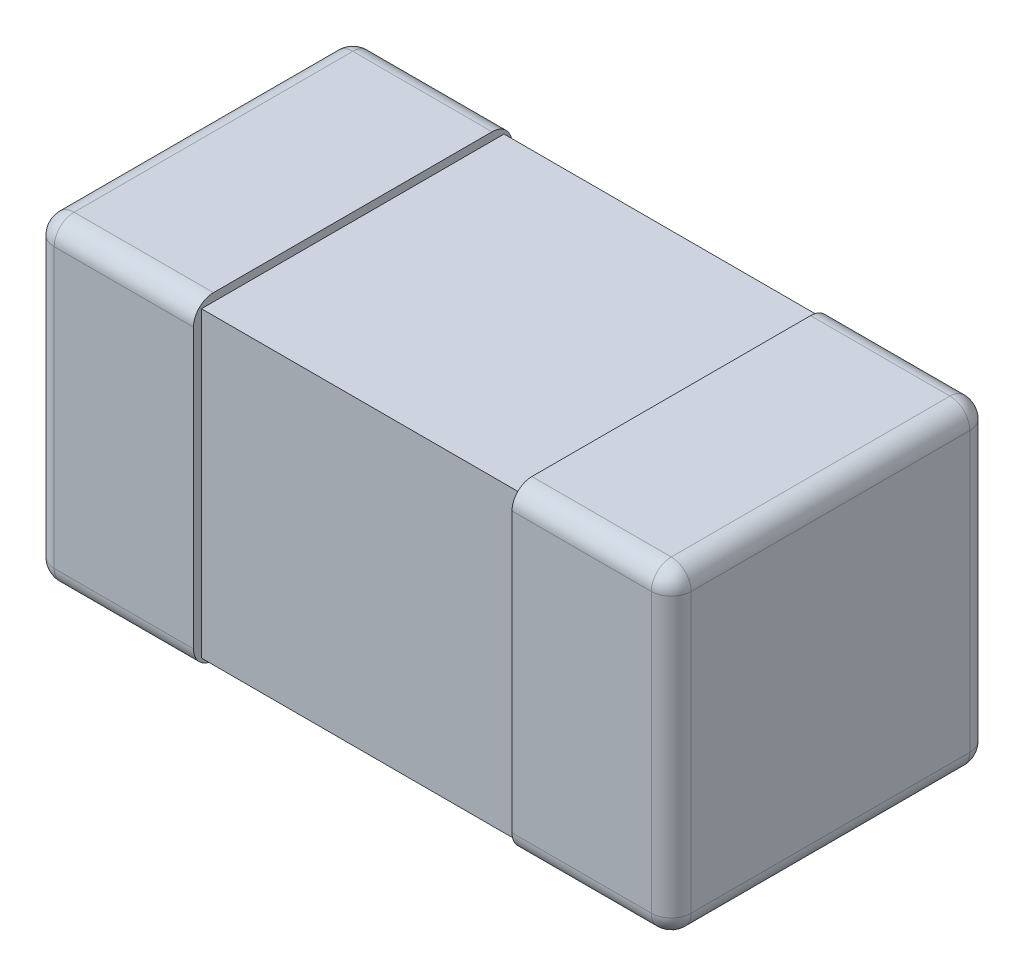
ISO-10303-21;
HEADER;
FILE_DESCRIPTION(('STEP AP214'),'2;1');
FILE_NAME('part.step','',(''),(''),'','','');
FILE_SCHEMA(('AUTOMOTIVE_DESIGN { 1 0 10303 214 1 1 1 1 }'));
ENDSEC;
DATA;
#1=APPLICATION_CONTEXT('core data for automotive mechanical design processes');
#2=APPLICATION_PROTOCOL_DEFINITION('international standard','automotive_design',2000,#1);
#3=PRODUCT_CONTEXT('',#1,'mechanical');
#4=PRODUCT('Part','Part','',(#3));
#5=PRODUCT_RELATED_PRODUCT_CATEGORY('part','',(#4));
#6=PRODUCT_DEFINITION_FORMATION('','',#4);
#7=PRODUCT_DEFINITION_CONTEXT('part definition',#1,'design');
#8=PRODUCT_DEFINITION('design','',#6,#7);
#9=PRODUCT_DEFINITION_SHAPE('','',#8);
#10=(LENGTH_UNIT() NAMED_UNIT(*) SI_UNIT(.MILLI.,.METRE.));
#11=(NAMED_UNIT(*) PLANE_ANGLE_UNIT() SI_UNIT($,.RADIAN.));
#12=(NAMED_UNIT(*) SI_UNIT($,.STERADIAN.) SOLID_ANGLE_UNIT());
#13=UNCERTAINTY_MEASURE_WITH_UNIT(LENGTH_MEASURE(1.E-05),#10,'distance_accuracy_value','');
#14=(GEOMETRIC_REPRESENTATION_CONTEXT(3) GLOBAL_UNCERTAINTY_ASSIGNED_CONTEXT((#13)) GLOBAL_UNIT_ASSIGNED_CONTEXT((#10,
#11,#12)) REPRESENTATION_CONTEXT('',''));
#15=CARTESIAN_POINT('',(0.,0.,0.));
#16=DIRECTION('',(0.,0.,1.));
#17=DIRECTION('',(1.,0.,0.));
#18=AXIS2_PLACEMENT_3D('',#15,#16,#17);
#19=CARTESIAN_POINT('',(-0.799999999999995,0.8,0.400000000000011));
#20=DIRECTION('',(0.,0.,-1.));
#21=DIRECTION('',(-1.,0.,0.));
#22=AXIS2_PLACEMENT_3D('',#19,#20,#21);
#23=PLANE('',#22);
#24=DIRECTION('',(0.,-1.,0.));
#25=VECTOR('',#24,1.);
#26=CARTESIAN_POINT('',(-0.399999999999995,0.8,0.400000000000011));
#27=LINE('',#26,#25);
#28=CARTESIAN_POINT('',(-0.399999999999995,0.75,0.400000000000011));
#29=VERTEX_POINT('',#28);
#30=CARTESIAN_POINT('',(-0.399999999999995,0.05,0.400000000000011));
#31=VERTEX_POINT('',#30);
#32=EDGE_CURVE('E253',#29,#31,#27,.T.);
#33=ORIENTED_EDGE('',*,*,#32,.F.);
#34=DIRECTION('',(1.,0.,0.));
#35=VECTOR('',#34,1.);
#36=CARTESIAN_POINT('',(-0.799999999999995,0.75,0.400000000000011));
#37=LINE('',#36,#35);
#38=CARTESIAN_POINT('',(-0.749999999999995,0.75,0.400000000000011));
#39=VERTEX_POINT('',#38);
#40=EDGE_CURVE('E284',#29,#39,#37,.F.);
#41=ORIENTED_EDGE('',*,*,#40,.T.);
#42=DIRECTION('',(0.,-1.,0.));
#43=VECTOR('',#42,1.);
#44=CARTESIAN_POINT('',(-0.749999999999995,0.8,0.400000000000011));
#45=LINE('',#44,#43);
#46=CARTESIAN_POINT('',(-0.749999999999995,0.05,0.400000000000011));
#47=VERTEX_POINT('',#46);
#48=EDGE_CURVE('E280',#39,#47,#45,.T.);
#49=ORIENTED_EDGE('',*,*,#48,.T.);
#50=DIRECTION('',(1.,0.,0.));
#51=VECTOR('',#50,1.);
#52=CARTESIAN_POINT('',(-0.799999999999995,0.05,0.400000000000011));
#53=LINE('',#52,#51);
#54=EDGE_CURVE('E282',#47,#31,#53,.T.);
#55=ORIENTED_EDGE('',*,*,#54,.T.);
#56=EDGE_LOOP('',(#33,#41,#49,#55));
#57=FACE_BOUND('',#56,.T.);
#58=ADVANCED_FACE('F38',(#57),#23,.F.);
#59=CARTESIAN_POINT('',(-0.799999999999995,0.8,-0.399999999999998));
#60=DIRECTION('',(0.,0.,1.));
#61=DIRECTION('',(1.,0.,0.));
#62=AXIS2_PLACEMENT_3D('',#59,#60,#61);
#63=PLANE('',#62);
#64=DIRECTION('',(0.,1.,0.));
#65=VECTOR('',#64,1.);
#66=CARTESIAN_POINT('',(-0.399999999999995,0.8,-0.399999999999998));
#67=LINE('',#66,#65);
#68=CARTESIAN_POINT('',(-0.399999999999995,0.05,-0.399999999999998));
#69=VERTEX_POINT('',#68);
#70=CARTESIAN_POINT('',(-0.399999999999995,0.75,-0.399999999999998));
#71=VERTEX_POINT('',#70);
#72=EDGE_CURVE('E250',#69,#71,#67,.T.);
#73=ORIENTED_EDGE('',*,*,#72,.F.);
#74=DIRECTION('',(-1.,0.,0.));
#75=VECTOR('',#74,1.);
#76=CARTESIAN_POINT('',(-0.799999999999995,0.05,-0.399999999999998));
#77=LINE('',#76,#75);
#78=CARTESIAN_POINT('',(-0.749999999999995,0.05,-0.399999999999998));
#79=VERTEX_POINT('',#78);
#80=EDGE_CURVE('E296',#69,#79,#77,.T.);
#81=ORIENTED_EDGE('',*,*,#80,.T.);
#82=DIRECTION('',(0.,-1.,0.));
#83=VECTOR('',#82,1.);
#84=CARTESIAN_POINT('',(-0.749999999999995,0.8,-0.399999999999998));
#85=LINE('',#84,#83);
#86=CARTESIAN_POINT('',(-0.749999999999995,0.75,-0.399999999999998));
#87=VERTEX_POINT('',#86);
#88=EDGE_CURVE('E292',#79,#87,#85,.F.);
#89=ORIENTED_EDGE('',*,*,#88,.T.);
#90=DIRECTION('',(-1.,0.,0.));
#91=VECTOR('',#90,1.);
#92=CARTESIAN_POINT('',(-0.399999999999995,0.75,-0.399999999999998));
#93=LINE('',#92,#91);
#94=EDGE_CURVE('E294',#87,#71,#93,.F.);
#95=ORIENTED_EDGE('',*,*,#94,.T.);
#96=EDGE_LOOP('',(#73,#81,#89,#95));
#97=FACE_BOUND('',#96,.T.);
#98=ADVANCED_FACE('F489',(#97),#63,.F.);
#99=CARTESIAN_POINT('',(0.,0.8,0.));
#100=DIRECTION('',(0.,1.,0.));
#101=DIRECTION('',(0.,0.,1.));
#102=AXIS2_PLACEMENT_3D('',#99,#100,#101);
#103=PLANE('',#102);
#104=DIRECTION('',(0.,0.,1.));
#105=VECTOR('',#104,1.);
#106=CARTESIAN_POINT('',(-0.749999999999995,0.8,0.400000000000011));
#107=LINE('',#106,#105);
#108=CARTESIAN_POINT('',(-0.749999999999995,0.8,-0.349999999999998));
#109=VERTEX_POINT('',#108);
#110=CARTESIAN_POINT('',(-0.749999999999995,0.8,0.350000000000011));
#111=VERTEX_POINT('',#110);
#112=EDGE_CURVE('E265',#109,#111,#107,.T.);
#113=ORIENTED_EDGE('',*,*,#112,.T.);
#114=DIRECTION('',(1.,0.,0.));
#115=VECTOR('',#114,1.);
#116=CARTESIAN_POINT('',(-0.399999999999995,0.8,0.350000000000011));
#117=LINE('',#116,#115);
#118=CARTESIAN_POINT('',(-0.399999999999995,0.8,0.350000000000011));
#119=VERTEX_POINT('',#118);
#120=EDGE_CURVE('E269',#111,#119,#117,.T.);
#121=ORIENTED_EDGE('',*,*,#120,.T.);
#122=DIRECTION('',(0.,0.,-1.));
#123=VECTOR('',#122,1.);
#124=CARTESIAN_POINT('',(-0.399999999999995,0.8,0.));
#125=LINE('',#124,#123);
#126=CARTESIAN_POINT('',(-0.399999999999995,0.8,-0.349999999999998));
#127=VERTEX_POINT('',#126);
#128=EDGE_CURVE('E256',#119,#127,#125,.T.);
#129=ORIENTED_EDGE('',*,*,#128,.T.);
#130=DIRECTION('',(-1.,0.,0.));
#131=VECTOR('',#130,1.);
#132=CARTESIAN_POINT('',(-0.799999999999995,0.8,-0.349999999999998));
#133=LINE('',#132,#131);
#134=EDGE_CURVE('E267',#127,#109,#133,.T.);
#135=ORIENTED_EDGE('',*,*,#134,.T.);
#136=EDGE_LOOP('',(#113,#121,#129,#135));
#137=FACE_BOUND('',#136,.T.);
#138=ADVANCED_FACE('F495',(#137),#103,.T.);
#139=CARTESIAN_POINT('',(0.,0.,0.));
#140=DIRECTION('',(0.,1.,0.));
#141=DIRECTION('',(0.,0.,1.));
#142=AXIS2_PLACEMENT_3D('',#139,#140,#141);
#143=PLANE('',#142);
#144=DIRECTION('',(0.,0.,-1.));
#145=VECTOR('',#144,1.);
#146=CARTESIAN_POINT('',(-0.399999999999995,0.,0.));
#147=LINE('',#146,#145);
#148=CARTESIAN_POINT('',(-0.399999999999995,0.,0.350000000000011));
#149=VERTEX_POINT('',#148);
#150=CARTESIAN_POINT('',(-0.399999999999995,0.,-0.349999999999998));
#151=VERTEX_POINT('',#150);
#152=EDGE_CURVE('E262',#149,#151,#147,.T.);
#153=ORIENTED_EDGE('',*,*,#152,.F.);
#154=DIRECTION('',(1.,0.,0.));
#155=VECTOR('',#154,1.);
#156=CARTESIAN_POINT('',(0.,0.,0.350000000000011));
#157=LINE('',#156,#155);
#158=CARTESIAN_POINT('',(-0.749999999999995,0.,0.350000000000011));
#159=VERTEX_POINT('',#158);
#160=EDGE_CURVE('E290',#149,#159,#157,.F.);
#161=ORIENTED_EDGE('',*,*,#160,.T.);
#162=DIRECTION('',(0.,0.,1.));
#163=VECTOR('',#162,1.);
#164=CARTESIAN_POINT('',(-0.749999999999995,0.,0.));
#165=LINE('',#164,#163);
#166=CARTESIAN_POINT('',(-0.749999999999995,0.,-0.349999999999998));
#167=VERTEX_POINT('',#166);
#168=EDGE_CURVE('E286',#159,#167,#165,.F.);
#169=ORIENTED_EDGE('',*,*,#168,.T.);
#170=DIRECTION('',(-1.,0.,0.));
#171=VECTOR('',#170,1.);
#172=CARTESIAN_POINT('',(0.,0.,-0.349999999999998));
#173=LINE('',#172,#171);
#174=EDGE_CURVE('E288',#167,#151,#173,.F.);
#175=ORIENTED_EDGE('',*,*,#174,.T.);
#176=EDGE_LOOP('',(#153,#161,#169,#175));
#177=FACE_BOUND('',#176,.T.);
#178=ADVANCED_FACE('F515',(#177),#143,.F.);
#179=CARTESIAN_POINT('',(-0.799999999999995,0.8,-0.399999999999998));
#180=DIRECTION('',(1.,0.,0.));
#181=DIRECTION('',(0.,0.,-1.));
#182=AXIS2_PLACEMENT_3D('',#179,#180,#181);
#183=PLANE('',#182);
#184=DIRECTION('',(0.,0.,1.));
#185=VECTOR('',#184,1.);
#186=CARTESIAN_POINT('',(-0.799999999999995,0.75,-0.399999999999998));
#187=LINE('',#186,#185);
#188=CARTESIAN_POINT('',(-0.799999999999995,0.75,0.350000000000011));
#189=VERTEX_POINT('',#188);
#190=CARTESIAN_POINT('',(-0.799999999999995,0.75,-0.349999999999998));
#191=VERTEX_POINT('',#190);
#192=EDGE_CURVE('E340',#189,#191,#187,.F.);
#193=ORIENTED_EDGE('',*,*,#192,.T.);
#194=DIRECTION('',(0.,-1.,0.));
#195=VECTOR('',#194,1.);
#196=CARTESIAN_POINT('',(-0.799999999999995,0.8,-0.349999999999998));
#197=LINE('',#196,#195);
#198=CARTESIAN_POINT('',(-0.799999999999995,0.05,-0.349999999999998));
#199=VERTEX_POINT('',#198);
#200=EDGE_CURVE('E13',#191,#199,#197,.T.);
#201=ORIENTED_EDGE('',*,*,#200,.T.);
#202=DIRECTION('',(0.,0.,1.));
#203=VECTOR('',#202,1.);
#204=CARTESIAN_POINT('',(-0.799999999999995,0.05,-0.399999999999998));
#205=LINE('',#204,#203);
#206=CARTESIAN_POINT('',(-0.799999999999995,0.05,0.350000000000011));
#207=VERTEX_POINT('',#206);
#208=EDGE_CURVE('E47',#199,#207,#205,.T.);
#209=ORIENTED_EDGE('',*,*,#208,.T.);
#210=DIRECTION('',(0.,-1.,0.));
#211=VECTOR('',#210,1.);
#212=CARTESIAN_POINT('',(-0.799999999999995,0.8,0.350000000000011));
#213=LINE('',#212,#211);
#214=EDGE_CURVE('E342',#207,#189,#213,.F.);
#215=ORIENTED_EDGE('',*,*,#214,.T.);
#216=EDGE_LOOP('',(#193,#201,#209,#215));
#217=FACE_BOUND('',#216,.T.);
#218=ADVANCED_FACE('F537',(#217),#183,.F.);
#219=CARTESIAN_POINT('',(-2.07279220613579,0.779999999999999,-0.379999999999998));
#220=DIRECTION('',(0.,1.,0.));
#221=DIRECTION('',(0.,0.,1.));
#222=AXIS2_PLACEMENT_3D('',#219,#220,#221);
#223=PLANE('',#222);
#224=DIRECTION('',(1.,0.,0.));
#225=VECTOR('',#224,1.);
#226=CARTESIAN_POINT('',(-2.07279220613579,0.780000000000001,0.380000000000011));
#227=LINE('',#226,#225);
#228=CARTESIAN_POINT('',(-0.399999999999995,0.780000000000001,0.380000000000011));
#229=VERTEX_POINT('',#228);
#230=CARTESIAN_POINT('',(0.399999999999995,0.780000000000001,0.380000000000011));
#231=VERTEX_POINT('',#230);
#232=EDGE_CURVE('E210',#229,#231,#227,.T.);
#233=ORIENTED_EDGE('',*,*,#232,.T.);
#234=DIRECTION('',(0.,0.,-1.));
#235=VECTOR('',#234,1.);
#236=CARTESIAN_POINT('',(0.399999999999995,0.779999999999999,-0.379999999999998));
#237=LINE('',#236,#235);
#238=CARTESIAN_POINT('',(0.399999999999995,0.779999999999999,-0.379999999999998));
#239=VERTEX_POINT('',#238);
#240=EDGE_CURVE('E223',#231,#239,#237,.T.);
#241=ORIENTED_EDGE('',*,*,#240,.T.);
#242=DIRECTION('',(1.,0.,0.));
#243=VECTOR('',#242,1.);
#244=CARTESIAN_POINT('',(-2.07279220613579,0.779999999999999,-0.379999999999998));
#245=LINE('',#244,#243);
#246=CARTESIAN_POINT('',(-0.399999999999995,0.779999999999999,-0.379999999999998));
#247=VERTEX_POINT('',#246);
#248=EDGE_CURVE('E225',#247,#239,#245,.T.);
#249=ORIENTED_EDGE('',*,*,#248,.F.);
#250=DIRECTION('',(0.,0.,-1.));
#251=VECTOR('',#250,1.);
#252=CARTESIAN_POINT('',(-0.399999999999995,0.779999999999999,-0.379999999999998));
#253=LINE('',#252,#251);
#254=EDGE_CURVE('E236',#229,#247,#253,.T.);
#255=ORIENTED_EDGE('',*,*,#254,.F.);
#256=EDGE_LOOP('',(#233,#241,#249,#255));
#257=FACE_BOUND('',#256,.T.);
#258=ADVANCED_FACE('F534',(#257),#223,.T.);
#259=CARTESIAN_POINT('',(-2.07279220613579,0.0199999999999992,0.380000000000011));
#260=DIRECTION('',(0.,0.,1.));
#261=DIRECTION('',(0.,-1.,0.));
#262=AXIS2_PLACEMENT_3D('',#259,#260,#261);
#263=PLANE('',#262);
#264=DIRECTION('',(1.,0.,0.));
#265=VECTOR('',#264,1.);
#266=CARTESIAN_POINT('',(-2.07279220613579,0.0199999999999992,0.380000000000011));
#267=LINE('',#266,#265);
#268=CARTESIAN_POINT('',(-0.399999999999995,0.0199999999999992,0.380000000000011));
#269=VERTEX_POINT('',#268);
#270=CARTESIAN_POINT('',(0.399999999999995,0.0199999999999992,0.380000000000011));
#271=VERTEX_POINT('',#270);
#272=EDGE_CURVE('E198',#269,#271,#267,.T.);
#273=ORIENTED_EDGE('',*,*,#272,.T.);
#274=DIRECTION('',(0.,1.,0.));
#275=VECTOR('',#274,1.);
#276=CARTESIAN_POINT('',(0.399999999999995,0.0199999999999992,0.380000000000011));
#277=LINE('',#276,#275);
#278=EDGE_CURVE('E203',#271,#231,#277,.T.);
#279=ORIENTED_EDGE('',*,*,#278,.T.);
#280=ORIENTED_EDGE('',*,*,#232,.F.);
#281=DIRECTION('',(0.,1.,0.));
#282=VECTOR('',#281,1.);
#283=CARTESIAN_POINT('',(-0.399999999999995,0.0199999999999992,0.380000000000011));
#284=LINE('',#283,#282);
#285=EDGE_CURVE('E206',#269,#229,#284,.T.);
#286=ORIENTED_EDGE('',*,*,#285,.F.);
#287=EDGE_LOOP('',(#273,#279,#280,#286));
#288=FACE_BOUND('',#287,.T.);
#289=ADVANCED_FACE('F200',(#288),#263,.T.);
#290=CARTESIAN_POINT('',(-2.07279220613579,0.0199999999999992,-0.379999999999998));
#291=DIRECTION('',(0.,-1.,0.));
#292=DIRECTION('',(0.,0.,-1.));
#293=AXIS2_PLACEMENT_3D('',#290,#291,#292);
#294=PLANE('',#293);
#295=DIRECTION('',(1.,0.,0.));
#296=VECTOR('',#295,1.);
#297=CARTESIAN_POINT('',(-2.07279220613579,0.0199999999999992,-0.379999999999998));
#298=LINE('',#297,#296);
#299=CARTESIAN_POINT('',(-0.399999999999995,0.0199999999999992,-0.379999999999998));
#300=VERTEX_POINT('',#299);
#301=CARTESIAN_POINT('',(0.399999999999995,0.0199999999999992,-0.379999999999998));
#302=VERTEX_POINT('',#301);
#303=EDGE_CURVE('E209',#300,#302,#298,.T.);
#304=ORIENTED_EDGE('',*,*,#303,.T.);
#305=DIRECTION('',(0.,0.,1.));
#306=VECTOR('',#305,1.);
#307=CARTESIAN_POINT('',(0.399999999999995,0.0199999999999992,-0.379999999999998));
#308=LINE('',#307,#306);
#309=EDGE_CURVE('E213',#302,#271,#308,.T.);
#310=ORIENTED_EDGE('',*,*,#309,.T.);
#311=ORIENTED_EDGE('',*,*,#272,.F.);
#312=DIRECTION('',(0.,0.,1.));
#313=VECTOR('',#312,1.);
#314=CARTESIAN_POINT('',(-0.399999999999995,0.0199999999999992,-0.379999999999998));
#315=LINE('',#314,#313);
#316=EDGE_CURVE('E231',#300,#269,#315,.T.);
#317=ORIENTED_EDGE('',*,*,#316,.F.);
#318=EDGE_LOOP('',(#304,#310,#311,#317));
#319=FACE_BOUND('',#318,.T.);
#320=ADVANCED_FACE('F214',(#319),#294,.T.);
#321=CARTESIAN_POINT('',(-2.07279220613579,0.779999999999999,-0.379999999999998));
#322=DIRECTION('',(0.,0.,-1.));
#323=DIRECTION('',(0.,1.,0.));
#324=AXIS2_PLACEMENT_3D('',#321,#322,#323);
#325=PLANE('',#324);
#326=ORIENTED_EDGE('',*,*,#248,.T.);
#327=DIRECTION('',(0.,-1.,0.));
#328=VECTOR('',#327,1.);
#329=CARTESIAN_POINT('',(0.399999999999995,0.779999999999999,-0.379999999999998));
#330=LINE('',#329,#328);
#331=EDGE_CURVE('E219',#239,#302,#330,.T.);
#332=ORIENTED_EDGE('',*,*,#331,.T.);
#333=ORIENTED_EDGE('',*,*,#303,.F.);
#334=DIRECTION('',(0.,-1.,0.));
#335=VECTOR('',#334,1.);
#336=CARTESIAN_POINT('',(-0.399999999999995,0.779999999999999,-0.379999999999998));
#337=LINE('',#336,#335);
#338=EDGE_CURVE('E233',#247,#300,#337,.T.);
#339=ORIENTED_EDGE('',*,*,#338,.F.);
#340=EDGE_LOOP('',(#326,#332,#333,#339));
#341=FACE_BOUND('',#340,.T.);
#342=ADVANCED_FACE('F526',(#341),#325,.T.);
#343=CARTESIAN_POINT('',(-0.399999999999995,0.8,-0.399999999999998));
#344=DIRECTION('',(1.,0.,0.));
#345=DIRECTION('',(0.,0.,-1.));
#346=AXIS2_PLACEMENT_3D('',#343,#344,#345);
#347=PLANE('',#346);
#348=ORIENTED_EDGE('',*,*,#128,.F.);
#349=CARTESIAN_POINT('',(-0.399999999999995,0.75,0.350000000000011));
#350=DIRECTION('',(1.,0.,0.));
#351=DIRECTION('',(0.,0.,-1.));
#352=AXIS2_PLACEMENT_3D('',#349,#350,#351);
#353=CIRCLE('',#352,0.05);
#354=EDGE_CURVE('E278',#119,#29,#353,.T.);
#355=ORIENTED_EDGE('',*,*,#354,.T.);
#356=ORIENTED_EDGE('',*,*,#32,.T.);
#357=CARTESIAN_POINT('',(-0.399999999999995,0.05,0.350000000000011));
#358=DIRECTION('',(1.,0.,0.));
#359=DIRECTION('',(0.,0.,-1.));
#360=AXIS2_PLACEMENT_3D('',#357,#358,#359);
#361=CIRCLE('',#360,0.05);
#362=EDGE_CURVE('E276',#31,#149,#361,.T.);
#363=ORIENTED_EDGE('',*,*,#362,.T.);
#364=ORIENTED_EDGE('',*,*,#152,.T.);
#365=CARTESIAN_POINT('',(-0.399999999999995,0.05,-0.349999999999998));
#366=DIRECTION('',(1.,0.,0.));
#367=DIRECTION('',(0.,0.,-1.));
#368=AXIS2_PLACEMENT_3D('',#365,#366,#367);
#369=CIRCLE('',#368,0.05);
#370=EDGE_CURVE('E274',#151,#69,#369,.T.);
#371=ORIENTED_EDGE('',*,*,#370,.T.);
#372=ORIENTED_EDGE('',*,*,#72,.T.);
#373=CARTESIAN_POINT('',(-0.399999999999995,0.75,-0.349999999999998));
#374=DIRECTION('',(1.,0.,0.));
#375=DIRECTION('',(0.,0.,-1.));
#376=AXIS2_PLACEMENT_3D('',#373,#374,#375);
#377=CIRCLE('',#376,0.05);
#378=EDGE_CURVE('E272',#71,#127,#377,.T.);
#379=ORIENTED_EDGE('',*,*,#378,.T.);
#380=EDGE_LOOP('',(#348,#355,#356,#363,#364,#371,#372,#379));
#381=FACE_BOUND('',#380,.T.);
#382=ORIENTED_EDGE('',*,*,#254,.T.);
#383=ORIENTED_EDGE('',*,*,#338,.T.);
#384=ORIENTED_EDGE('',*,*,#316,.T.);
#385=ORIENTED_EDGE('',*,*,#285,.T.);
#386=EDGE_LOOP('',(#382,#383,#384,#385));
#387=FACE_BOUND('',#386,.T.);
#388=ADVANCED_FACE('F521',(#381,#387),#347,.T.);
#389=CARTESIAN_POINT('',(0.399999999999995,0.8,-0.399999999999998));
#390=DIRECTION('',(-1.,0.,0.));
#391=DIRECTION('',(0.,0.,1.));
#392=AXIS2_PLACEMENT_3D('',#389,#390,#391);
#393=PLANE('',#392);
#394=DIRECTION('',(0.,-1.,0.));
#395=VECTOR('',#394,1.);
#396=CARTESIAN_POINT('',(0.399999999999995,0.8,-0.399999999999998));
#397=LINE('',#396,#395);
#398=CARTESIAN_POINT('',(0.399999999999995,0.75,-0.399999999999998));
#399=VERTEX_POINT('',#398);
#400=CARTESIAN_POINT('',(0.399999999999995,0.05,-0.399999999999998));
#401=VERTEX_POINT('',#400);
#402=EDGE_CURVE('E230',#399,#401,#397,.T.);
#403=ORIENTED_EDGE('',*,*,#402,.T.);
#404=CARTESIAN_POINT('',(0.399999999999995,0.05,-0.349999999999998));
#405=DIRECTION('',(-1.,0.,0.));
#406=DIRECTION('',(0.,0.,1.));
#407=AXIS2_PLACEMENT_3D('',#404,#405,#406);
#408=CIRCLE('',#407,0.05);
#409=CARTESIAN_POINT('',(0.399999999999995,0.,-0.349999999999998));
#410=VERTEX_POINT('',#409);
#411=EDGE_CURVE('E311',#401,#410,#408,.T.);
#412=ORIENTED_EDGE('',*,*,#411,.T.);
#413=DIRECTION('',(0.,0.,1.));
#414=VECTOR('',#413,1.);
#415=CARTESIAN_POINT('',(0.399999999999995,0.,0.));
#416=LINE('',#415,#414);
#417=CARTESIAN_POINT('',(0.399999999999995,0.,0.350000000000011));
#418=VERTEX_POINT('',#417);
#419=EDGE_CURVE('E259',#410,#418,#416,.T.);
#420=ORIENTED_EDGE('',*,*,#419,.T.);
#421=CARTESIAN_POINT('',(0.399999999999995,0.05,0.350000000000011));
#422=DIRECTION('',(-1.,0.,0.));
#423=DIRECTION('',(0.,0.,1.));
#424=AXIS2_PLACEMENT_3D('',#421,#422,#423);
#425=CIRCLE('',#424,0.05);
#426=CARTESIAN_POINT('',(0.399999999999995,0.05,0.400000000000011));
#427=VERTEX_POINT('',#426);
#428=EDGE_CURVE('E309',#418,#427,#425,.T.);
#429=ORIENTED_EDGE('',*,*,#428,.T.);
#430=DIRECTION('',(0.,1.,0.));
#431=VECTOR('',#430,1.);
#432=CARTESIAN_POINT('',(0.399999999999995,0.8,0.400000000000011));
#433=LINE('',#432,#431);
#434=CARTESIAN_POINT('',(0.399999999999995,0.75,0.400000000000011));
#435=VERTEX_POINT('',#434);
#436=EDGE_CURVE('E244',#427,#435,#433,.T.);
#437=ORIENTED_EDGE('',*,*,#436,.T.);
#438=CARTESIAN_POINT('',(0.399999999999995,0.75,0.350000000000011));
#439=DIRECTION('',(-1.,0.,0.));
#440=DIRECTION('',(0.,0.,1.));
#441=AXIS2_PLACEMENT_3D('',#438,#439,#440);
#442=CIRCLE('',#441,0.05);
#443=CARTESIAN_POINT('',(0.399999999999995,0.8,0.350000000000011));
#444=VERTEX_POINT('',#443);
#445=EDGE_CURVE('E307',#435,#444,#442,.T.);
#446=ORIENTED_EDGE('',*,*,#445,.T.);
#447=DIRECTION('',(0.,0.,1.));
#448=VECTOR('',#447,1.);
#449=CARTESIAN_POINT('',(0.399999999999995,0.8,0.));
#450=LINE('',#449,#448);
#451=CARTESIAN_POINT('',(0.399999999999995,0.8,-0.349999999999998));
#452=VERTEX_POINT('',#451);
#453=EDGE_CURVE('E247',#452,#444,#450,.T.);
#454=ORIENTED_EDGE('',*,*,#453,.F.);
#455=CARTESIAN_POINT('',(0.399999999999995,0.75,-0.349999999999998));
#456=DIRECTION('',(-1.,0.,0.));
#457=DIRECTION('',(0.,0.,1.));
#458=AXIS2_PLACEMENT_3D('',#455,#456,#457);
#459=CIRCLE('',#458,0.05);
#460=EDGE_CURVE('E305',#452,#399,#459,.T.);
#461=ORIENTED_EDGE('',*,*,#460,.T.);
#462=EDGE_LOOP('',(#403,#412,#420,#429,#437,#446,#454,#461));
#463=FACE_BOUND('',#462,.T.);
#464=ORIENTED_EDGE('',*,*,#331,.F.);
#465=ORIENTED_EDGE('',*,*,#240,.F.);
#466=ORIENTED_EDGE('',*,*,#278,.F.);
#467=ORIENTED_EDGE('',*,*,#309,.F.);
#468=EDGE_LOOP('',(#464,#465,#466,#467));
#469=FACE_BOUND('',#468,.T.);
#470=ADVANCED_FACE('F221',(#463,#469),#393,.T.);
#471=CARTESIAN_POINT('',(0.799999999999995,0.8,-0.399999999999998));
#472=DIRECTION('',(-1.,0.,0.));
#473=DIRECTION('',(0.,0.,1.));
#474=AXIS2_PLACEMENT_3D('',#471,#472,#473);
#475=PLANE('',#474);
#476=DIRECTION('',(0.,0.,-1.));
#477=VECTOR('',#476,1.);
#478=CARTESIAN_POINT('',(0.799999999999995,0.05,-0.399999999999998));
#479=LINE('',#478,#477);
#480=CARTESIAN_POINT('',(0.799999999999995,0.05,0.350000000000011));
#481=VERTEX_POINT('',#480);
#482=CARTESIAN_POINT('',(0.799999999999995,0.05,-0.349999999999998));
#483=VERTEX_POINT('',#482);
#484=EDGE_CURVE('E335',#481,#483,#479,.T.);
#485=ORIENTED_EDGE('',*,*,#484,.T.);
#486=DIRECTION('',(0.,-1.,0.));
#487=VECTOR('',#486,1.);
#488=CARTESIAN_POINT('',(0.799999999999995,0.8,-0.349999999999998));
#489=LINE('',#488,#487);
#490=CARTESIAN_POINT('',(0.799999999999995,0.75,-0.349999999999998));
#491=VERTEX_POINT('',#490);
#492=EDGE_CURVE('E337',#483,#491,#489,.F.);
#493=ORIENTED_EDGE('',*,*,#492,.T.);
#494=DIRECTION('',(0.,0.,-1.));
#495=VECTOR('',#494,1.);
#496=CARTESIAN_POINT('',(0.799999999999995,0.75,0.400000000000011));
#497=LINE('',#496,#495);
#498=CARTESIAN_POINT('',(0.799999999999995,0.75,0.350000000000011));
#499=VERTEX_POINT('',#498);
#500=EDGE_CURVE('E331',#491,#499,#497,.F.);
#501=ORIENTED_EDGE('',*,*,#500,.T.);
#502=DIRECTION('',(0.,-1.,0.));
#503=VECTOR('',#502,1.);
#504=CARTESIAN_POINT('',(0.799999999999995,0.8,0.350000000000011));
#505=LINE('',#504,#503);
#506=EDGE_CURVE('E333',#499,#481,#505,.T.);
#507=ORIENTED_EDGE('',*,*,#506,.T.);
#508=EDGE_LOOP('',(#485,#493,#501,#507));
#509=FACE_BOUND('',#508,.T.);
#510=ADVANCED_FACE('F448',(#509),#475,.F.);
#511=ORIENTED_EDGE('',*,*,#419,.F.);
#512=DIRECTION('',(-1.,0.,0.));
#513=VECTOR('',#512,1.);
#514=CARTESIAN_POINT('',(0.,0.,-0.349999999999998));
#515=LINE('',#514,#513);
#516=CARTESIAN_POINT('',(0.749999999999995,0.,-0.349999999999998));
#517=VERTEX_POINT('',#516);
#518=EDGE_CURVE('E317',#410,#517,#515,.F.);
#519=ORIENTED_EDGE('',*,*,#518,.T.);
#520=DIRECTION('',(0.,0.,-1.));
#521=VECTOR('',#520,1.);
#522=CARTESIAN_POINT('',(0.749999999999995,0.,0.));
#523=LINE('',#522,#521);
#524=CARTESIAN_POINT('',(0.749999999999995,0.,0.350000000000011));
#525=VERTEX_POINT('',#524);
#526=EDGE_CURVE('E313',#517,#525,#523,.F.);
#527=ORIENTED_EDGE('',*,*,#526,.T.);
#528=DIRECTION('',(1.,0.,0.));
#529=VECTOR('',#528,1.);
#530=CARTESIAN_POINT('',(0.,0.,0.350000000000011));
#531=LINE('',#530,#529);
#532=EDGE_CURVE('E315',#525,#418,#531,.F.);
#533=ORIENTED_EDGE('',*,*,#532,.T.);
#534=EDGE_LOOP('',(#511,#519,#527,#533));
#535=FACE_BOUND('',#534,.T.);
#536=ADVANCED_FACE('F477',(#535),#143,.F.);
#537=ORIENTED_EDGE('',*,*,#453,.T.);
#538=DIRECTION('',(1.,0.,0.));
#539=VECTOR('',#538,1.);
#540=CARTESIAN_POINT('',(0.799999999999995,0.8,0.350000000000011));
#541=LINE('',#540,#539);
#542=CARTESIAN_POINT('',(0.749999999999995,0.8,0.350000000000011));
#543=VERTEX_POINT('',#542);
#544=EDGE_CURVE('E329',#444,#543,#541,.T.);
#545=ORIENTED_EDGE('',*,*,#544,.T.);
#546=DIRECTION('',(0.,0.,-1.));
#547=VECTOR('',#546,1.);
#548=CARTESIAN_POINT('',(0.749999999999995,0.8,-0.399999999999998));
#549=LINE('',#548,#547);
#550=CARTESIAN_POINT('',(0.749999999999995,0.8,-0.349999999999998));
#551=VERTEX_POINT('',#550);
#552=EDGE_CURVE('E325',#543,#551,#549,.T.);
#553=ORIENTED_EDGE('',*,*,#552,.T.);
#554=DIRECTION('',(-1.,0.,0.));
#555=VECTOR('',#554,1.);
#556=CARTESIAN_POINT('',(0.399999999999995,0.8,-0.349999999999998));
#557=LINE('',#556,#555);
#558=EDGE_CURVE('E327',#551,#452,#557,.T.);
#559=ORIENTED_EDGE('',*,*,#558,.T.);
#560=EDGE_LOOP('',(#537,#545,#553,#559));
#561=FACE_BOUND('',#560,.T.);
#562=ADVANCED_FACE('F464',(#561),#103,.T.);
#563=DIRECTION('',(0.,-1.,0.));
#564=VECTOR('',#563,1.);
#565=CARTESIAN_POINT('',(0.749999999999995,0.8,-0.399999999999998));
#566=LINE('',#565,#564);
#567=CARTESIAN_POINT('',(0.749999999999995,0.75,-0.399999999999998));
#568=VERTEX_POINT('',#567);
#569=CARTESIAN_POINT('',(0.749999999999995,0.05,-0.399999999999998));
#570=VERTEX_POINT('',#569);
#571=EDGE_CURVE('E298',#568,#570,#566,.T.);
#572=ORIENTED_EDGE('',*,*,#571,.T.);
#573=DIRECTION('',(-1.,0.,0.));
#574=VECTOR('',#573,1.);
#575=CARTESIAN_POINT('',(-0.799999999999995,0.05,-0.399999999999998));
#576=LINE('',#575,#574);
#577=EDGE_CURVE('E302',#570,#401,#576,.T.);
#578=ORIENTED_EDGE('',*,*,#577,.T.);
#579=ORIENTED_EDGE('',*,*,#402,.F.);
#580=DIRECTION('',(-1.,0.,0.));
#581=VECTOR('',#580,1.);
#582=CARTESIAN_POINT('',(0.799999999999995,0.75,-0.399999999999998));
#583=LINE('',#582,#581);
#584=EDGE_CURVE('E300',#399,#568,#583,.F.);
#585=ORIENTED_EDGE('',*,*,#584,.T.);
#586=EDGE_LOOP('',(#572,#578,#579,#585));
#587=FACE_BOUND('',#586,.T.);
#588=ADVANCED_FACE('F471',(#587),#63,.F.);
#589=ORIENTED_EDGE('',*,*,#436,.F.);
#590=DIRECTION('',(1.,0.,0.));
#591=VECTOR('',#590,1.);
#592=CARTESIAN_POINT('',(-0.799999999999995,0.05,0.400000000000011));
#593=LINE('',#592,#591);
#594=CARTESIAN_POINT('',(0.749999999999995,0.05,0.400000000000011));
#595=VERTEX_POINT('',#594);
#596=EDGE_CURVE('E323',#427,#595,#593,.T.);
#597=ORIENTED_EDGE('',*,*,#596,.T.);
#598=DIRECTION('',(0.,-1.,0.));
#599=VECTOR('',#598,1.);
#600=CARTESIAN_POINT('',(0.749999999999995,0.8,0.400000000000011));
#601=LINE('',#600,#599);
#602=CARTESIAN_POINT('',(0.749999999999995,0.75,0.400000000000011));
#603=VERTEX_POINT('',#602);
#604=EDGE_CURVE('E319',#595,#603,#601,.F.);
#605=ORIENTED_EDGE('',*,*,#604,.T.);
#606=DIRECTION('',(1.,0.,0.));
#607=VECTOR('',#606,1.);
#608=CARTESIAN_POINT('',(0.399999999999995,0.75,0.400000000000011));
#609=LINE('',#608,#607);
#610=EDGE_CURVE('E321',#603,#435,#609,.F.);
#611=ORIENTED_EDGE('',*,*,#610,.T.);
#612=EDGE_LOOP('',(#589,#597,#605,#611));
#613=FACE_BOUND('',#612,.T.);
#614=ADVANCED_FACE('F426',(#613),#23,.F.);
#615=CARTESIAN_POINT('',(-0.799999999999995,0.05,-0.349999999999998));
#616=DIRECTION('',(-1.,0.,0.));
#617=DIRECTION('',(0.,0.,1.));
#618=AXIS2_PLACEMENT_3D('',#615,#616,#617);
#619=CYLINDRICAL_SURFACE('',#618,0.05);
#620=CARTESIAN_POINT('',(-0.749999999999995,0.05,-0.349999999999998));
#621=DIRECTION('',(-1.,0.,0.));
#622=DIRECTION('',(0.,0.,1.));
#623=AXIS2_PLACEMENT_3D('',#620,#621,#622);
#624=CIRCLE('',#623,0.05);
#625=EDGE_CURVE('E377',#79,#167,#624,.T.);
#626=ORIENTED_EDGE('',*,*,#625,.F.);
#627=ORIENTED_EDGE('',*,*,#80,.F.);
#628=ORIENTED_EDGE('',*,*,#370,.F.);
#629=ORIENTED_EDGE('',*,*,#174,.F.);
#630=EDGE_LOOP('',(#626,#627,#628,#629));
#631=FACE_BOUND('',#630,.T.);
#632=ADVANCED_FACE('F502',(#631),#619,.T.);
#633=CARTESIAN_POINT('',(-0.749999999999995,0.05,-0.349999999999998));
#634=DIRECTION('',(0.,0.,1.));
#635=DIRECTION('',(1.,0.,0.));
#636=AXIS2_PLACEMENT_3D('',#633,#634,#635);
#637=SPHERICAL_SURFACE('',#636,0.05);
#638=CARTESIAN_POINT('',(-0.749999999999995,0.05,-0.349999999999998));
#639=DIRECTION('',(0.,-1.,0.));
#640=DIRECTION('',(0.,0.,-1.));
#641=AXIS2_PLACEMENT_3D('',#638,#639,#640);
#642=CIRCLE('',#641,0.05);
#643=EDGE_CURVE('E372',#79,#199,#642,.F.);
#644=ORIENTED_EDGE('',*,*,#643,.F.);
#645=ORIENTED_EDGE('',*,*,#625,.T.);
#646=CARTESIAN_POINT('',(-0.749999999999995,0.05,-0.349999999999998));
#647=DIRECTION('',(0.,0.,-1.));
#648=DIRECTION('',(-1.,0.,0.));
#649=AXIS2_PLACEMENT_3D('',#646,#647,#648);
#650=CIRCLE('',#649,0.05);
#651=EDGE_CURVE('E375',#199,#167,#650,.F.);
#652=ORIENTED_EDGE('',*,*,#651,.F.);
#653=EDGE_LOOP('',(#644,#645,#652));
#654=FACE_BOUND('',#653,.T.);
#655=ADVANCED_FACE('F507',(#654),#637,.T.);
#656=CARTESIAN_POINT('',(-0.799999999999995,0.05,0.350000000000011));
#657=DIRECTION('',(1.,0.,0.));
#658=DIRECTION('',(0.,0.,-1.));
#659=AXIS2_PLACEMENT_3D('',#656,#657,#658);
#660=CYLINDRICAL_SURFACE('',#659,0.05);
#661=ORIENTED_EDGE('',*,*,#362,.F.);
#662=ORIENTED_EDGE('',*,*,#54,.F.);
#663=CARTESIAN_POINT('',(-0.749999999999995,0.05,0.350000000000011));
#664=DIRECTION('',(-1.,0.,0.));
#665=DIRECTION('',(0.,0.,1.));
#666=AXIS2_PLACEMENT_3D('',#663,#664,#665);
#667=CIRCLE('',#666,0.05);
#668=EDGE_CURVE('E369',#159,#47,#667,.T.);
#669=ORIENTED_EDGE('',*,*,#668,.F.);
#670=ORIENTED_EDGE('',*,*,#160,.F.);
#671=EDGE_LOOP('',(#661,#662,#669,#670));
#672=FACE_BOUND('',#671,.T.);
#673=ADVANCED_FACE('F569',(#672),#660,.T.);
#674=CARTESIAN_POINT('',(-0.749999999999995,0.05,-0.399999999999998));
#675=DIRECTION('',(0.,0.,1.));
#676=DIRECTION('',(1.,0.,0.));
#677=AXIS2_PLACEMENT_3D('',#674,#675,#676);
#678=CYLINDRICAL_SURFACE('',#677,0.05);
#679=ORIENTED_EDGE('',*,*,#651,.T.);
#680=ORIENTED_EDGE('',*,*,#168,.F.);
#681=CARTESIAN_POINT('',(-0.749999999999995,0.05,0.350000000000011));
#682=DIRECTION('',(0.,0.,1.));
#683=DIRECTION('',(1.,0.,0.));
#684=AXIS2_PLACEMENT_3D('',#681,#682,#683);
#685=CIRCLE('',#684,0.05);
#686=EDGE_CURVE('E366',#207,#159,#685,.T.);
#687=ORIENTED_EDGE('',*,*,#686,.F.);
#688=ORIENTED_EDGE('',*,*,#208,.F.);
#689=EDGE_LOOP('',(#679,#680,#687,#688));
#690=FACE_BOUND('',#689,.T.);
#691=ADVANCED_FACE('F598',(#690),#678,.T.);
#692=CARTESIAN_POINT('',(-0.749999999999995,0.8,-0.349999999999998));
#693=DIRECTION('',(0.,-1.,0.));
#694=DIRECTION('',(0.,0.,-1.));
#695=AXIS2_PLACEMENT_3D('',#692,#693,#694);
#696=CYLINDRICAL_SURFACE('',#695,0.05);
#697=ORIENTED_EDGE('',*,*,#643,.T.);
#698=ORIENTED_EDGE('',*,*,#200,.F.);
#699=CARTESIAN_POINT('',(-0.749999999999995,0.75,-0.349999999999998));
#700=DIRECTION('',(0.,1.,0.));
#701=DIRECTION('',(0.,0.,1.));
#702=AXIS2_PLACEMENT_3D('',#699,#700,#701);
#703=CIRCLE('',#702,0.05);
#704=EDGE_CURVE('E363',#87,#191,#703,.T.);
#705=ORIENTED_EDGE('',*,*,#704,.F.);
#706=ORIENTED_EDGE('',*,*,#88,.F.);
#707=EDGE_LOOP('',(#697,#698,#705,#706));
#708=FACE_BOUND('',#707,.T.);
#709=ADVANCED_FACE('F580',(#708),#696,.T.);
#710=CARTESIAN_POINT('',(0.,0.75,-0.349999999999998));
#711=DIRECTION('',(1.,0.,0.));
#712=DIRECTION('',(0.,0.,-1.));
#713=AXIS2_PLACEMENT_3D('',#710,#711,#712);
#714=CYLINDRICAL_SURFACE('',#713,0.05);
#715=ORIENTED_EDGE('',*,*,#378,.F.);
#716=ORIENTED_EDGE('',*,*,#94,.F.);
#717=CARTESIAN_POINT('',(-0.749999999999995,0.75,-0.349999999999998));
#718=DIRECTION('',(-1.,0.,0.));
#719=DIRECTION('',(0.,0.,1.));
#720=AXIS2_PLACEMENT_3D('',#717,#718,#719);
#721=CIRCLE('',#720,0.05);
#722=EDGE_CURVE('E360',#109,#87,#721,.T.);
#723=ORIENTED_EDGE('',*,*,#722,.F.);
#724=ORIENTED_EDGE('',*,*,#134,.F.);
#725=EDGE_LOOP('',(#715,#716,#723,#724));
#726=FACE_BOUND('',#725,.T.);
#727=ADVANCED_FACE('F589',(#726),#714,.T.);
#728=CARTESIAN_POINT('',(-0.749999999999995,0.05,0.350000000000011));
#729=DIRECTION('',(0.,0.,1.));
#730=DIRECTION('',(1.,0.,0.));
#731=AXIS2_PLACEMENT_3D('',#728,#729,#730);
#732=SPHERICAL_SURFACE('',#731,0.05);
#733=ORIENTED_EDGE('',*,*,#686,.T.);
#734=ORIENTED_EDGE('',*,*,#668,.T.);
#735=CARTESIAN_POINT('',(-0.749999999999995,0.05,0.350000000000011));
#736=DIRECTION('',(0.,-1.,0.));
#737=DIRECTION('',(0.,0.,-1.));
#738=AXIS2_PLACEMENT_3D('',#735,#736,#737);
#739=CIRCLE('',#738,0.05);
#740=EDGE_CURVE('E357',#207,#47,#739,.F.);
#741=ORIENTED_EDGE('',*,*,#740,.F.);
#742=EDGE_LOOP('',(#733,#734,#741));
#743=FACE_BOUND('',#742,.T.);
#744=ADVANCED_FACE('F573',(#743),#732,.T.);
#745=CARTESIAN_POINT('',(-0.749999999999995,0.75,-0.349999999999998));
#746=DIRECTION('',(0.,0.,1.));
#747=DIRECTION('',(1.,0.,0.));
#748=AXIS2_PLACEMENT_3D('',#745,#746,#747);
#749=SPHERICAL_SURFACE('',#748,0.05);
#750=ORIENTED_EDGE('',*,*,#722,.T.);
#751=ORIENTED_EDGE('',*,*,#704,.T.);
#752=CARTESIAN_POINT('',(-0.749999999999995,0.75,-0.349999999999998));
#753=DIRECTION('',(0.,0.,-1.));
#754=DIRECTION('',(-1.,0.,0.));
#755=AXIS2_PLACEMENT_3D('',#752,#753,#754);
#756=CIRCLE('',#755,0.05);
#757=EDGE_CURVE('E354',#109,#191,#756,.F.);
#758=ORIENTED_EDGE('',*,*,#757,.F.);
#759=EDGE_LOOP('',(#750,#751,#758));
#760=FACE_BOUND('',#759,.T.);
#761=ADVANCED_FACE('F585',(#760),#749,.T.);
#762=CARTESIAN_POINT('',(-0.749999999999995,0.8,0.350000000000011));
#763=DIRECTION('',(0.,-1.,0.));
#764=DIRECTION('',(0.,0.,-1.));
#765=AXIS2_PLACEMENT_3D('',#762,#763,#764);
#766=CYLINDRICAL_SURFACE('',#765,0.05);
#767=ORIENTED_EDGE('',*,*,#740,.T.);
#768=ORIENTED_EDGE('',*,*,#48,.F.);
#769=CARTESIAN_POINT('',(-0.749999999999995,0.75,0.350000000000011));
#770=DIRECTION('',(0.,1.,0.));
#771=DIRECTION('',(0.,0.,1.));
#772=AXIS2_PLACEMENT_3D('',#769,#770,#771);
#773=CIRCLE('',#772,0.05);
#774=EDGE_CURVE('E351',#189,#39,#773,.T.);
#775=ORIENTED_EDGE('',*,*,#774,.F.);
#776=ORIENTED_EDGE('',*,*,#214,.F.);
#777=EDGE_LOOP('',(#767,#768,#775,#776));
#778=FACE_BOUND('',#777,.T.);
#779=ADVANCED_FACE('F576',(#778),#766,.T.);
#780=CARTESIAN_POINT('',(-0.749999999999995,0.75,0.));
#781=DIRECTION('',(0.,0.,-1.));
#782=DIRECTION('',(-1.,0.,0.));
#783=AXIS2_PLACEMENT_3D('',#780,#781,#782);
#784=CYLINDRICAL_SURFACE('',#783,0.05);
#785=ORIENTED_EDGE('',*,*,#757,.T.);
#786=ORIENTED_EDGE('',*,*,#192,.F.);
#787=CARTESIAN_POINT('',(-0.749999999999995,0.75,0.350000000000011));
#788=DIRECTION('',(0.,0.,1.));
#789=DIRECTION('',(1.,0.,0.));
#790=AXIS2_PLACEMENT_3D('',#787,#788,#789);
#791=CIRCLE('',#790,0.05);
#792=EDGE_CURVE('E348',#111,#189,#791,.T.);
#793=ORIENTED_EDGE('',*,*,#792,.F.);
#794=ORIENTED_EDGE('',*,*,#112,.F.);
#795=EDGE_LOOP('',(#785,#786,#793,#794));
#796=FACE_BOUND('',#795,.T.);
#797=ADVANCED_FACE('F556',(#796),#784,.T.);
#798=CARTESIAN_POINT('',(-0.749999999999995,0.75,0.350000000000011));
#799=DIRECTION('',(0.,0.,1.));
#800=DIRECTION('',(1.,0.,0.));
#801=AXIS2_PLACEMENT_3D('',#798,#799,#800);
#802=SPHERICAL_SURFACE('',#801,0.05);
#803=ORIENTED_EDGE('',*,*,#792,.T.);
#804=ORIENTED_EDGE('',*,*,#774,.T.);
#805=CARTESIAN_POINT('',(-0.749999999999995,0.75,0.350000000000011));
#806=DIRECTION('',(-1.,0.,0.));
#807=DIRECTION('',(0.,0.,1.));
#808=AXIS2_PLACEMENT_3D('',#805,#806,#807);
#809=CIRCLE('',#808,0.05);
#810=EDGE_CURVE('E345',#111,#39,#809,.F.);
#811=ORIENTED_EDGE('',*,*,#810,.F.);
#812=EDGE_LOOP('',(#803,#804,#811));
#813=FACE_BOUND('',#812,.T.);
#814=ADVANCED_FACE('F559',(#813),#802,.T.);
#815=CARTESIAN_POINT('',(0.,0.75,0.350000000000011));
#816=DIRECTION('',(-1.,0.,0.));
#817=DIRECTION('',(0.,0.,1.));
#818=AXIS2_PLACEMENT_3D('',#815,#816,#817);
#819=CYLINDRICAL_SURFACE('',#818,0.05);
#820=ORIENTED_EDGE('',*,*,#810,.T.);
#821=ORIENTED_EDGE('',*,*,#40,.F.);
#822=ORIENTED_EDGE('',*,*,#354,.F.);
#823=ORIENTED_EDGE('',*,*,#120,.F.);
#824=EDGE_LOOP('',(#820,#821,#822,#823));
#825=FACE_BOUND('',#824,.T.);
#826=ADVANCED_FACE('F562',(#825),#819,.T.);
#827=CARTESIAN_POINT('',(0.,0.75,0.350000000000011));
#828=DIRECTION('',(-1.,0.,0.));
#829=DIRECTION('',(0.,0.,1.));
#830=AXIS2_PLACEMENT_3D('',#827,#828,#829);
#831=CYLINDRICAL_SURFACE('',#830,0.05);
#832=CARTESIAN_POINT('',(0.749999999999995,0.75,0.350000000000011));
#833=DIRECTION('',(1.,0.,0.));
#834=DIRECTION('',(0.,0.,-1.));
#835=AXIS2_PLACEMENT_3D('',#832,#833,#834);
#836=CIRCLE('',#835,0.05);
#837=EDGE_CURVE('E42',#543,#603,#836,.T.);
#838=ORIENTED_EDGE('',*,*,#837,.F.);
#839=ORIENTED_EDGE('',*,*,#544,.F.);
#840=ORIENTED_EDGE('',*,*,#445,.F.);
#841=ORIENTED_EDGE('',*,*,#610,.F.);
#842=EDGE_LOOP('',(#838,#839,#840,#841));
#843=FACE_BOUND('',#842,.T.);
#844=ADVANCED_FACE('F40',(#843),#831,.T.);
#845=CARTESIAN_POINT('',(0.749999999999995,0.75,0.350000000000011));
#846=DIRECTION('',(0.,0.,1.));
#847=DIRECTION('',(1.,0.,0.));
#848=AXIS2_PLACEMENT_3D('',#845,#846,#847);
#849=SPHERICAL_SURFACE('',#848,0.05);
#850=CARTESIAN_POINT('',(0.749999999999995,0.75,0.350000000000011));
#851=DIRECTION('',(0.,0.,1.));
#852=DIRECTION('',(1.,0.,0.));
#853=AXIS2_PLACEMENT_3D('',#850,#851,#852);
#854=CIRCLE('',#853,0.05);
#855=EDGE_CURVE('E406',#543,#499,#854,.F.);
#856=ORIENTED_EDGE('',*,*,#855,.F.);
#857=ORIENTED_EDGE('',*,*,#837,.T.);
#858=CARTESIAN_POINT('',(0.749999999999995,0.75,0.350000000000011));
#859=DIRECTION('',(0.,1.,0.));
#860=DIRECTION('',(0.,0.,1.));
#861=AXIS2_PLACEMENT_3D('',#858,#859,#860);
#862=CIRCLE('',#861,0.05);
#863=EDGE_CURVE('E408',#499,#603,#862,.F.);
#864=ORIENTED_EDGE('',*,*,#863,.F.);
#865=EDGE_LOOP('',(#856,#857,#864));
#866=FACE_BOUND('',#865,.T.);
#867=ADVANCED_FACE('F418',(#866),#849,.T.);
#868=CARTESIAN_POINT('',(-0.799999999999995,0.05,0.350000000000011));
#869=DIRECTION('',(1.,0.,0.));
#870=DIRECTION('',(0.,0.,-1.));
#871=AXIS2_PLACEMENT_3D('',#868,#869,#870);
#872=CYLINDRICAL_SURFACE('',#871,0.05);
#873=ORIENTED_EDGE('',*,*,#428,.F.);
#874=ORIENTED_EDGE('',*,*,#532,.F.);
#875=CARTESIAN_POINT('',(0.749999999999995,0.05,0.350000000000011));
#876=DIRECTION('',(1.,0.,0.));
#877=DIRECTION('',(0.,0.,-1.));
#878=AXIS2_PLACEMENT_3D('',#875,#876,#877);
#879=CIRCLE('',#878,0.05);
#880=EDGE_CURVE('E403',#595,#525,#879,.T.);
#881=ORIENTED_EDGE('',*,*,#880,.F.);
#882=ORIENTED_EDGE('',*,*,#596,.F.);
#883=EDGE_LOOP('',(#873,#874,#881,#882));
#884=FACE_BOUND('',#883,.T.);
#885=ADVANCED_FACE('F434',(#884),#872,.T.);
#886=CARTESIAN_POINT('',(0.749999999999995,0.8,0.350000000000011));
#887=DIRECTION('',(0.,-1.,0.));
#888=DIRECTION('',(0.,0.,-1.));
#889=AXIS2_PLACEMENT_3D('',#886,#887,#888);
#890=CYLINDRICAL_SURFACE('',#889,0.05);
#891=ORIENTED_EDGE('',*,*,#863,.T.);
#892=ORIENTED_EDGE('',*,*,#604,.F.);
#893=CARTESIAN_POINT('',(0.749999999999995,0.05,0.350000000000011));
#894=DIRECTION('',(0.,-1.,0.));
#895=DIRECTION('',(0.,0.,-1.));
#896=AXIS2_PLACEMENT_3D('',#893,#894,#895);
#897=CIRCLE('',#896,0.05);
#898=EDGE_CURVE('E400',#481,#595,#897,.T.);
#899=ORIENTED_EDGE('',*,*,#898,.F.);
#900=ORIENTED_EDGE('',*,*,#506,.F.);
#901=EDGE_LOOP('',(#891,#892,#899,#900));
#902=FACE_BOUND('',#901,.T.);
#903=ADVANCED_FACE('F437',(#902),#890,.T.);
#904=CARTESIAN_POINT('',(0.749999999999995,0.75,0.));
#905=DIRECTION('',(0.,0.,1.));
#906=DIRECTION('',(1.,0.,0.));
#907=AXIS2_PLACEMENT_3D('',#904,#905,#906);
#908=CYLINDRICAL_SURFACE('',#907,0.05);
#909=ORIENTED_EDGE('',*,*,#855,.T.);
#910=ORIENTED_EDGE('',*,*,#500,.F.);
#911=CARTESIAN_POINT('',(0.749999999999995,0.75,-0.349999999999998));
#912=DIRECTION('',(0.,0.,-1.));
#913=DIRECTION('',(-1.,0.,0.));
#914=AXIS2_PLACEMENT_3D('',#911,#912,#913);
#915=CIRCLE('',#914,0.05);
#916=EDGE_CURVE('E397',#551,#491,#915,.T.);
#917=ORIENTED_EDGE('',*,*,#916,.F.);
#918=ORIENTED_EDGE('',*,*,#552,.F.);
#919=EDGE_LOOP('',(#909,#910,#917,#918));
#920=FACE_BOUND('',#919,.T.);
#921=ADVANCED_FACE('F461',(#920),#908,.T.);
#922=CARTESIAN_POINT('',(0.,0.75,-0.349999999999998));
#923=DIRECTION('',(1.,0.,0.));
#924=DIRECTION('',(0.,0.,-1.));
#925=AXIS2_PLACEMENT_3D('',#922,#923,#924);
#926=CYLINDRICAL_SURFACE('',#925,0.05);
#927=ORIENTED_EDGE('',*,*,#460,.F.);
#928=ORIENTED_EDGE('',*,*,#558,.F.);
#929=CARTESIAN_POINT('',(0.749999999999995,0.75,-0.349999999999998));
#930=DIRECTION('',(1.,0.,0.));
#931=DIRECTION('',(0.,1.,0.));
#932=AXIS2_PLACEMENT_3D('',#929,#930,#931);
#933=CIRCLE('',#932,0.05);
#934=EDGE_CURVE('E394',#568,#551,#933,.T.);
#935=ORIENTED_EDGE('',*,*,#934,.F.);
#936=ORIENTED_EDGE('',*,*,#584,.F.);
#937=EDGE_LOOP('',(#927,#928,#935,#936));
#938=FACE_BOUND('',#937,.T.);
#939=ADVANCED_FACE('F467',(#938),#926,.T.);
#940=CARTESIAN_POINT('',(0.749999999999995,0.05,0.350000000000011));
#941=DIRECTION('',(0.,0.,1.));
#942=DIRECTION('',(1.,0.,0.));
#943=AXIS2_PLACEMENT_3D('',#940,#941,#942);
#944=SPHERICAL_SURFACE('',#943,0.05);
#945=ORIENTED_EDGE('',*,*,#898,.T.);
#946=ORIENTED_EDGE('',*,*,#880,.T.);
#947=CARTESIAN_POINT('',(0.749999999999995,0.05,0.350000000000011));
#948=DIRECTION('',(0.,0.,1.));
#949=DIRECTION('',(1.,0.,0.));
#950=AXIS2_PLACEMENT_3D('',#947,#948,#949);
#951=CIRCLE('',#950,0.05);
#952=EDGE_CURVE('E391',#481,#525,#951,.F.);
#953=ORIENTED_EDGE('',*,*,#952,.F.);
#954=EDGE_LOOP('',(#945,#946,#953));
#955=FACE_BOUND('',#954,.T.);
#956=ADVANCED_FACE('F441',(#955),#944,.T.);
#957=CARTESIAN_POINT('',(0.749999999999995,0.75,-0.349999999999998));
#958=DIRECTION('',(0.,0.,1.));
#959=DIRECTION('',(1.,0.,0.));
#960=AXIS2_PLACEMENT_3D('',#957,#958,#959);
#961=SPHERICAL_SURFACE('',#960,0.05);
#962=ORIENTED_EDGE('',*,*,#934,.T.);
#963=ORIENTED_EDGE('',*,*,#916,.T.);
#964=CARTESIAN_POINT('',(0.749999999999995,0.75,-0.349999999999998));
#965=DIRECTION('',(0.,1.,0.));
#966=DIRECTION('',(0.,0.,1.));
#967=AXIS2_PLACEMENT_3D('',#964,#965,#966);
#968=CIRCLE('',#967,0.05);
#969=EDGE_CURVE('E389',#568,#491,#968,.F.);
#970=ORIENTED_EDGE('',*,*,#969,.F.);
#971=EDGE_LOOP('',(#962,#963,#970));
#972=FACE_BOUND('',#971,.T.);
#973=ADVANCED_FACE('F458',(#972),#961,.T.);
#974=CARTESIAN_POINT('',(0.749999999999995,0.05,-0.399999999999998));
#975=DIRECTION('',(0.,0.,-1.));
#976=DIRECTION('',(-1.,0.,0.));
#977=AXIS2_PLACEMENT_3D('',#974,#975,#976);
#978=CYLINDRICAL_SURFACE('',#977,0.05);
#979=ORIENTED_EDGE('',*,*,#952,.T.);
#980=ORIENTED_EDGE('',*,*,#526,.F.);
#981=CARTESIAN_POINT('',(0.749999999999995,0.05,-0.349999999999998));
#982=DIRECTION('',(0.,0.,-1.));
#983=DIRECTION('',(-1.,0.,0.));
#984=AXIS2_PLACEMENT_3D('',#981,#982,#983);
#985=CIRCLE('',#984,0.05);
#986=EDGE_CURVE('E386',#483,#517,#985,.T.);
#987=ORIENTED_EDGE('',*,*,#986,.F.);
#988=ORIENTED_EDGE('',*,*,#484,.F.);
#989=EDGE_LOOP('',(#979,#980,#987,#988));
#990=FACE_BOUND('',#989,.T.);
#991=ADVANCED_FACE('F445',(#990),#978,.T.);
#992=CARTESIAN_POINT('',(0.749999999999995,0.8,-0.349999999999998));
#993=DIRECTION('',(0.,-1.,0.));
#994=DIRECTION('',(0.,0.,-1.));
#995=AXIS2_PLACEMENT_3D('',#992,#993,#994);
#996=CYLINDRICAL_SURFACE('',#995,0.05);
#997=ORIENTED_EDGE('',*,*,#969,.T.);
#998=ORIENTED_EDGE('',*,*,#492,.F.);
#999=CARTESIAN_POINT('',(0.749999999999995,0.05,-0.349999999999998));
#1000=DIRECTION('',(0.,-1.,0.));
#1001=DIRECTION('',(0.,0.,-1.));
#1002=AXIS2_PLACEMENT_3D('',#999,#1000,#1001);
#1003=CIRCLE('',#1002,0.05);
#1004=EDGE_CURVE('E383',#570,#483,#1003,.T.);
#1005=ORIENTED_EDGE('',*,*,#1004,.F.);
#1006=ORIENTED_EDGE('',*,*,#571,.F.);
#1007=EDGE_LOOP('',(#997,#998,#1005,#1006));
#1008=FACE_BOUND('',#1007,.T.);
#1009=ADVANCED_FACE('F451',(#1008),#996,.T.);
#1010=CARTESIAN_POINT('',(0.749999999999995,0.05,-0.349999999999998));
#1011=DIRECTION('',(0.,0.,1.));
#1012=DIRECTION('',(1.,0.,0.));
#1013=AXIS2_PLACEMENT_3D('',#1010,#1011,#1012);
#1014=SPHERICAL_SURFACE('',#1013,0.05);
#1015=ORIENTED_EDGE('',*,*,#1004,.T.);
#1016=ORIENTED_EDGE('',*,*,#986,.T.);
#1017=CARTESIAN_POINT('',(0.749999999999995,0.05,-0.349999999999998));
#1018=DIRECTION('',(1.,0.,0.));
#1019=DIRECTION('',(0.,0.,-1.));
#1020=AXIS2_PLACEMENT_3D('',#1017,#1018,#1019);
#1021=CIRCLE('',#1020,0.05);
#1022=EDGE_CURVE('E380',#570,#517,#1021,.F.);
#1023=ORIENTED_EDGE('',*,*,#1022,.F.);
#1024=EDGE_LOOP('',(#1015,#1016,#1023));
#1025=FACE_BOUND('',#1024,.T.);
#1026=ADVANCED_FACE('F479',(#1025),#1014,.T.);
#1027=CARTESIAN_POINT('',(-0.799999999999995,0.05,-0.349999999999998));
#1028=DIRECTION('',(-1.,0.,0.));
#1029=DIRECTION('',(0.,0.,1.));
#1030=AXIS2_PLACEMENT_3D('',#1027,#1028,#1029);
#1031=CYLINDRICAL_SURFACE('',#1030,0.05);
#1032=ORIENTED_EDGE('',*,*,#1022,.T.);
#1033=ORIENTED_EDGE('',*,*,#518,.F.);
#1034=ORIENTED_EDGE('',*,*,#411,.F.);
#1035=ORIENTED_EDGE('',*,*,#577,.F.);
#1036=EDGE_LOOP('',(#1032,#1033,#1034,#1035));
#1037=FACE_BOUND('',#1036,.T.);
#1038=ADVANCED_FACE('F474',(#1037),#1031,.T.);
#1039=CLOSED_SHELL('',(#58,#98,#138,#178,#218,#258,#289,#320,#342,#388,#470,#510,#536,#562,#588,
#614,#632,#655,#673,#691,#709,#727,#744,#761,#779,#797,#814,#826,#844,#867,#885,#903,#921,#939,
#956,#973,#991,#1009,#1026,#1038));
#1040=MANIFOLD_SOLID_BREP('B2',#1039);
#1041=ADVANCED_BREP_SHAPE_REPRESENTATION('',(#18,#1040),#14);
#1042=SHAPE_DEFINITION_REPRESENTATION(#9,#1041);
ENDSEC;
END-ISO-10303-21;
